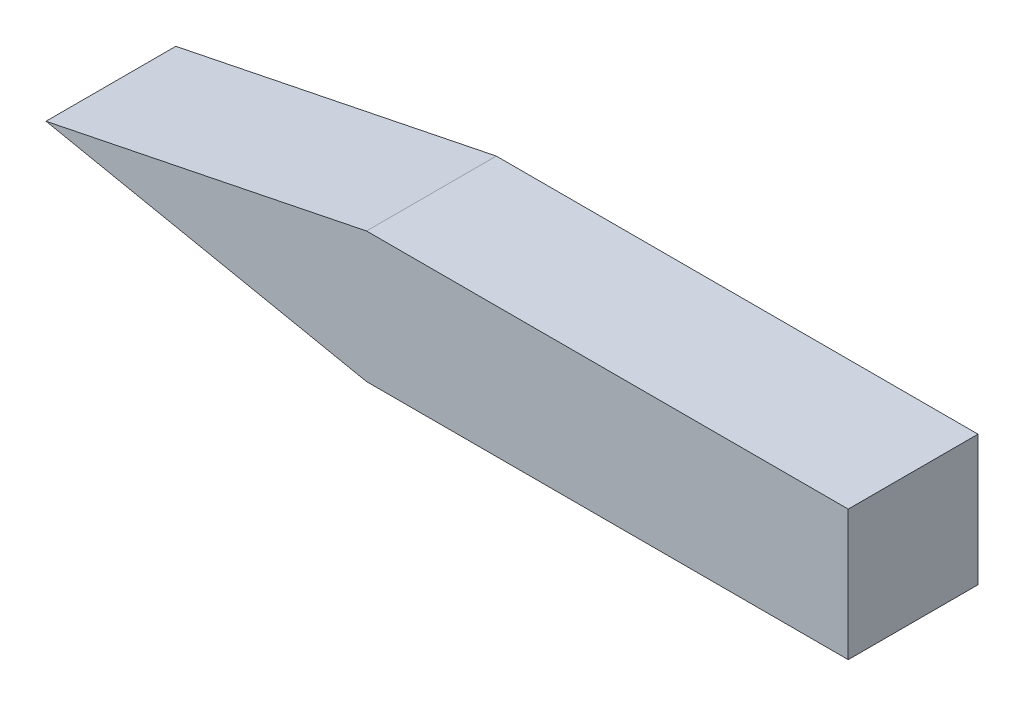
ISO-10303-21;
HEADER;
FILE_DESCRIPTION(('STEP AP214'),'2;1');
FILE_NAME('part.step','',(''),(''),'','','');
FILE_SCHEMA(('AUTOMOTIVE_DESIGN { 1 0 10303 214 1 1 1 1 }'));
ENDSEC;
DATA;
#1=APPLICATION_CONTEXT('core data for automotive mechanical design processes');
#2=APPLICATION_PROTOCOL_DEFINITION('international standard','automotive_design',2000,#1);
#3=PRODUCT_CONTEXT('',#1,'mechanical');
#4=PRODUCT('Part','Part','',(#3));
#5=PRODUCT_RELATED_PRODUCT_CATEGORY('part','',(#4));
#6=PRODUCT_DEFINITION_FORMATION('','',#4);
#7=PRODUCT_DEFINITION_CONTEXT('part definition',#1,'design');
#8=PRODUCT_DEFINITION('design','',#6,#7);
#9=PRODUCT_DEFINITION_SHAPE('','',#8);
#10=(LENGTH_UNIT() NAMED_UNIT(*) SI_UNIT(.MILLI.,.METRE.));
#11=(NAMED_UNIT(*) PLANE_ANGLE_UNIT() SI_UNIT($,.RADIAN.));
#12=(NAMED_UNIT(*) SI_UNIT($,.STERADIAN.) SOLID_ANGLE_UNIT());
#13=UNCERTAINTY_MEASURE_WITH_UNIT(LENGTH_MEASURE(1.E-05),#10,'distance_accuracy_value','');
#14=(GEOMETRIC_REPRESENTATION_CONTEXT(3) GLOBAL_UNCERTAINTY_ASSIGNED_CONTEXT((#13)) GLOBAL_UNIT_ASSIGNED_CONTEXT((#10,
#11,#12)) REPRESENTATION_CONTEXT('',''));
#15=CARTESIAN_POINT('',(0.,0.,0.));
#16=DIRECTION('',(0.,0.,1.));
#17=DIRECTION('',(1.,0.,0.));
#18=AXIS2_PLACEMENT_3D('',#15,#16,#17);
#19=CARTESIAN_POINT('',(0.,3.01516307745924,6.));
#20=DIRECTION('',(0.,1.,0.));
#21=DIRECTION('',(0.,0.,1.));
#22=AXIS2_PLACEMENT_3D('',#19,#20,#21);
#23=PLANE('',#22);
#24=DIRECTION('',(1.,0.,0.));
#25=VECTOR('',#24,1.);
#26=CARTESIAN_POINT('',(0.,3.01516307745924,0.));
#27=LINE('',#26,#25);
#28=CARTESIAN_POINT('',(14.82,3.01516307745924,0.));
#29=VERTEX_POINT('',#28);
#30=CARTESIAN_POINT('',(37.09,3.01516307745924,0.));
#31=VERTEX_POINT('',#30);
#32=EDGE_CURVE('E169',#29,#31,#27,.T.);
#33=ORIENTED_EDGE('',*,*,#32,.F.);
#34=DIRECTION('',(0.,0.,-1.));
#35=VECTOR('',#34,1.);
#36=CARTESIAN_POINT('',(14.82,3.01516307745924,6.));
#37=LINE('',#36,#35);
#38=CARTESIAN_POINT('',(14.82,3.01516307745924,6.));
#39=VERTEX_POINT('',#38);
#40=EDGE_CURVE('E98',#39,#29,#37,.T.);
#41=ORIENTED_EDGE('',*,*,#40,.F.);
#42=DIRECTION('',(1.,0.,0.));
#43=VECTOR('',#42,1.);
#44=CARTESIAN_POINT('',(0.,3.01516307745924,6.));
#45=LINE('',#44,#43);
#46=CARTESIAN_POINT('',(37.09,3.01516307745924,6.));
#47=VERTEX_POINT('',#46);
#48=EDGE_CURVE('E154',#39,#47,#45,.T.);
#49=ORIENTED_EDGE('',*,*,#48,.T.);
#50=DIRECTION('',(0.,0.,-1.));
#51=VECTOR('',#50,1.);
#52=CARTESIAN_POINT('',(37.09,3.01516307745924,6.));
#53=LINE('',#52,#51);
#54=EDGE_CURVE('E114',#47,#31,#53,.T.);
#55=ORIENTED_EDGE('',*,*,#54,.T.);
#56=EDGE_LOOP('',(#33,#41,#49,#55));
#57=FACE_BOUND('',#56,.T.);
#58=ADVANCED_FACE('F78',(#57),#23,.T.);
#59=CARTESIAN_POINT('',(0.,0.,0.));
#60=DIRECTION('',(0.,0.,1.));
#61=DIRECTION('',(1.,0.,0.));
#62=AXIS2_PLACEMENT_3D('',#59,#60,#61);
#63=PLANE('',#62);
#64=DIRECTION('',(0.97992470462083,0.199367934417198,0.));
#65=VECTOR('',#64,1.);
#66=CARTESIAN_POINT('',(0.,0.,0.));
#67=LINE('',#66,#65);
#68=CARTESIAN_POINT('',(0.,0.,0.));
#69=VERTEX_POINT('',#68);
#70=EDGE_CURVE('E82',#69,#29,#67,.T.);
#71=ORIENTED_EDGE('',*,*,#70,.T.);
#72=ORIENTED_EDGE('',*,*,#32,.T.);
#73=DIRECTION('',(0.,-1.,0.));
#74=VECTOR('',#73,1.);
#75=CARTESIAN_POINT('',(37.09,0.,0.));
#76=LINE('',#75,#74);
#77=CARTESIAN_POINT('',(37.09,-3.01516307745924,0.));
#78=VERTEX_POINT('',#77);
#79=EDGE_CURVE('E166',#31,#78,#76,.T.);
#80=ORIENTED_EDGE('',*,*,#79,.T.);
#81=DIRECTION('',(1.,0.,0.));
#82=VECTOR('',#81,1.);
#83=CARTESIAN_POINT('',(0.,-3.01516307745924,0.));
#84=LINE('',#83,#82);
#85=CARTESIAN_POINT('',(14.82,-3.01516307745924,0.));
#86=VERTEX_POINT('',#85);
#87=EDGE_CURVE('E147',#86,#78,#84,.T.);
#88=ORIENTED_EDGE('',*,*,#87,.F.);
#89=DIRECTION('',(0.979924704620829,-0.199367934417198,0.));
#90=VECTOR('',#89,1.);
#91=CARTESIAN_POINT('',(0.,0.,0.));
#92=LINE('',#91,#90);
#93=EDGE_CURVE('E160',#69,#86,#92,.T.);
#94=ORIENTED_EDGE('',*,*,#93,.F.);
#95=EDGE_LOOP('',(#71,#72,#80,#88,#94));
#96=FACE_BOUND('',#95,.T.);
#97=ADVANCED_FACE('F182',(#96),#63,.F.);
#98=CARTESIAN_POINT('',(37.09,0.,6.));
#99=DIRECTION('',(1.,0.,0.));
#100=DIRECTION('',(0.,0.,-1.));
#101=AXIS2_PLACEMENT_3D('',#98,#99,#100);
#102=PLANE('',#101);
#103=ORIENTED_EDGE('',*,*,#79,.F.);
#104=ORIENTED_EDGE('',*,*,#54,.F.);
#105=DIRECTION('',(0.,-1.,0.));
#106=VECTOR('',#105,1.);
#107=CARTESIAN_POINT('',(37.09,0.,6.));
#108=LINE('',#107,#106);
#109=CARTESIAN_POINT('',(37.09,-3.01516307745924,6.));
#110=VERTEX_POINT('',#109);
#111=EDGE_CURVE('E135',#47,#110,#108,.T.);
#112=ORIENTED_EDGE('',*,*,#111,.T.);
#113=DIRECTION('',(0.,0.,-1.));
#114=VECTOR('',#113,1.);
#115=CARTESIAN_POINT('',(37.09,-3.01516307745924,6.));
#116=LINE('',#115,#114);
#117=EDGE_CURVE('E144',#110,#78,#116,.T.);
#118=ORIENTED_EDGE('',*,*,#117,.T.);
#119=EDGE_LOOP('',(#103,#104,#112,#118));
#120=FACE_BOUND('',#119,.T.);
#121=ADVANCED_FACE('F152',(#120),#102,.T.);
#122=CARTESIAN_POINT('',(0.,-3.01516307745924,6.));
#123=DIRECTION('',(0.,1.,0.));
#124=DIRECTION('',(0.,0.,1.));
#125=AXIS2_PLACEMENT_3D('',#122,#123,#124);
#126=PLANE('',#125);
#127=ORIENTED_EDGE('',*,*,#87,.T.);
#128=ORIENTED_EDGE('',*,*,#117,.F.);
#129=DIRECTION('',(1.,0.,0.));
#130=VECTOR('',#129,1.);
#131=CARTESIAN_POINT('',(0.,-3.01516307745924,6.));
#132=LINE('',#131,#130);
#133=CARTESIAN_POINT('',(14.82,-3.01516307745924,6.));
#134=VERTEX_POINT('',#133);
#135=EDGE_CURVE('E130',#134,#110,#132,.T.);
#136=ORIENTED_EDGE('',*,*,#135,.F.);
#137=DIRECTION('',(0.,0.,-1.));
#138=VECTOR('',#137,1.);
#139=CARTESIAN_POINT('',(14.82,-3.01516307745924,6.));
#140=LINE('',#139,#138);
#141=EDGE_CURVE('E89',#134,#86,#140,.T.);
#142=ORIENTED_EDGE('',*,*,#141,.T.);
#143=EDGE_LOOP('',(#127,#128,#136,#142));
#144=FACE_BOUND('',#143,.T.);
#145=ADVANCED_FACE('F145',(#144),#126,.F.);
#146=CARTESIAN_POINT('',(0.,0.,6.));
#147=DIRECTION('',(0.199367934417198,0.979924704620829,0.));
#148=DIRECTION('',(-0.979924704620829,0.199367934417198,0.));
#149=AXIS2_PLACEMENT_3D('',#146,#147,#148);
#150=PLANE('',#149);
#151=ORIENTED_EDGE('',*,*,#93,.T.);
#152=ORIENTED_EDGE('',*,*,#141,.F.);
#153=DIRECTION('',(0.979924704620829,-0.199367934417198,0.));
#154=VECTOR('',#153,1.);
#155=CARTESIAN_POINT('',(0.,0.,6.));
#156=LINE('',#155,#154);
#157=CARTESIAN_POINT('',(0.,0.,6.));
#158=VERTEX_POINT('',#157);
#159=EDGE_CURVE('E137',#158,#134,#156,.T.);
#160=ORIENTED_EDGE('',*,*,#159,.F.);
#161=DIRECTION('',(0.,0.,-1.));
#162=VECTOR('',#161,1.);
#163=CARTESIAN_POINT('',(0.,0.,6.));
#164=LINE('',#163,#162);
#165=EDGE_CURVE('E12',#158,#69,#164,.T.);
#166=ORIENTED_EDGE('',*,*,#165,.T.);
#167=EDGE_LOOP('',(#151,#152,#160,#166));
#168=FACE_BOUND('',#167,.T.);
#169=ADVANCED_FACE('F194',(#168),#150,.F.);
#170=CARTESIAN_POINT('',(0.,0.,6.));
#171=DIRECTION('',(0.,0.,1.));
#172=DIRECTION('',(1.,0.,0.));
#173=AXIS2_PLACEMENT_3D('',#170,#171,#172);
#174=PLANE('',#173);
#175=ORIENTED_EDGE('',*,*,#48,.F.);
#176=DIRECTION('',(0.97992470462083,0.199367934417198,0.));
#177=VECTOR('',#176,1.);
#178=CARTESIAN_POINT('',(0.,0.,6.));
#179=LINE('',#178,#177);
#180=EDGE_CURVE('E163',#158,#39,#179,.T.);
#181=ORIENTED_EDGE('',*,*,#180,.F.);
#182=ORIENTED_EDGE('',*,*,#159,.T.);
#183=ORIENTED_EDGE('',*,*,#135,.T.);
#184=ORIENTED_EDGE('',*,*,#111,.F.);
#185=EDGE_LOOP('',(#175,#181,#182,#183,#184));
#186=FACE_BOUND('',#185,.T.);
#187=ADVANCED_FACE('F133',(#186),#174,.T.);
#188=CARTESIAN_POINT('',(0.,0.,6.));
#189=DIRECTION('',(-0.199367934417198,0.979924704620829,0.));
#190=DIRECTION('',(-0.979924704620829,-0.199367934417198,0.));
#191=AXIS2_PLACEMENT_3D('',#188,#189,#190);
#192=PLANE('',#191);
#193=ORIENTED_EDGE('',*,*,#70,.F.);
#194=ORIENTED_EDGE('',*,*,#165,.F.);
#195=ORIENTED_EDGE('',*,*,#180,.T.);
#196=ORIENTED_EDGE('',*,*,#40,.T.);
#197=EDGE_LOOP('',(#193,#194,#195,#196));
#198=FACE_BOUND('',#197,.T.);
#199=ADVANCED_FACE('F80',(#198),#192,.T.);
#200=CLOSED_SHELL('',(#58,#97,#121,#145,#169,#187,#199));
#201=MANIFOLD_SOLID_BREP('B2',#200);
#202=ADVANCED_BREP_SHAPE_REPRESENTATION('',(#18,#201),#14);
#203=SHAPE_DEFINITION_REPRESENTATION(#9,#202);
ENDSEC;
END-ISO-10303-21;
